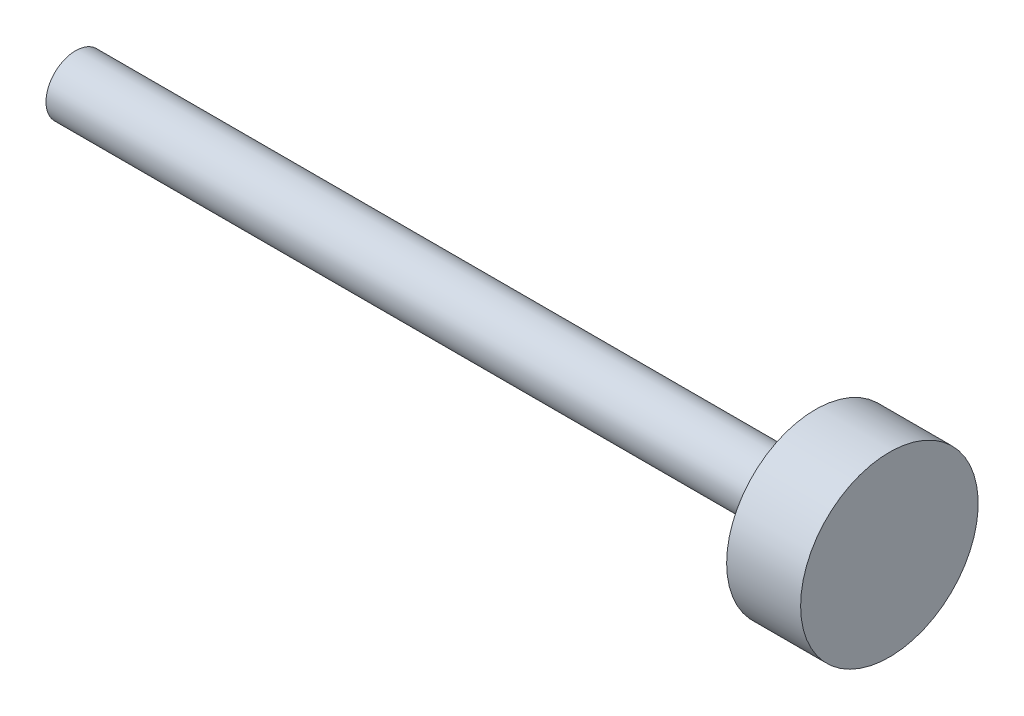
ISO-10303-21;
HEADER;
FILE_DESCRIPTION(('STEP AP214'),'2;1');
FILE_NAME('part.step','',(''),(''),'','','');
FILE_SCHEMA(('AUTOMOTIVE_DESIGN { 1 0 10303 214 1 1 1 1 }'));
ENDSEC;
DATA;
#1=APPLICATION_CONTEXT('core data for automotive mechanical design processes');
#2=APPLICATION_PROTOCOL_DEFINITION('international standard','automotive_design',2000,#1);
#3=PRODUCT_CONTEXT('',#1,'mechanical');
#4=PRODUCT('Part','Part','',(#3));
#5=PRODUCT_RELATED_PRODUCT_CATEGORY('part','',(#4));
#6=PRODUCT_DEFINITION_FORMATION('','',#4);
#7=PRODUCT_DEFINITION_CONTEXT('part definition',#1,'design');
#8=PRODUCT_DEFINITION('design','',#6,#7);
#9=PRODUCT_DEFINITION_SHAPE('','',#8);
#10=(LENGTH_UNIT() NAMED_UNIT(*) SI_UNIT(.MILLI.,.METRE.));
#11=(NAMED_UNIT(*) PLANE_ANGLE_UNIT() SI_UNIT($,.RADIAN.));
#12=(NAMED_UNIT(*) SI_UNIT($,.STERADIAN.) SOLID_ANGLE_UNIT());
#13=UNCERTAINTY_MEASURE_WITH_UNIT(LENGTH_MEASURE(1.E-05),#10,'distance_accuracy_value','');
#14=(GEOMETRIC_REPRESENTATION_CONTEXT(3) GLOBAL_UNCERTAINTY_ASSIGNED_CONTEXT((#13)) GLOBAL_UNIT_ASSIGNED_CONTEXT((#10,
#11,#12)) REPRESENTATION_CONTEXT('',''));
#15=CARTESIAN_POINT('',(0.,0.,0.));
#16=DIRECTION('',(0.,0.,1.));
#17=DIRECTION('',(1.,0.,0.));
#18=AXIS2_PLACEMENT_3D('',#15,#16,#17);
#19=CARTESIAN_POINT('',(58.1045877181206,0.,0.));
#20=DIRECTION('',(-1.,0.,0.));
#21=DIRECTION('',(0.,0.,1.));
#22=AXIS2_PLACEMENT_3D('',#19,#20,#21);
#23=PLANE('',#22);
#24=CARTESIAN_POINT('',(58.1045877181206,0.,0.));
#25=DIRECTION('',(-1.,0.,0.));
#26=DIRECTION('',(0.,0.,1.));
#27=AXIS2_PLACEMENT_3D('',#24,#25,#26);
#28=CIRCLE('',#27,12.);
#29=CARTESIAN_POINT('',(58.1045877181206,0.,12.));
#30=VERTEX_POINT('',#29);
#31=EDGE_CURVE('E10',#30,#30,#28,.T.);
#32=ORIENTED_EDGE('',*,*,#31,.F.);
#33=EDGE_LOOP('',(#32));
#34=FACE_BOUND('',#33,.T.);
#35=ADVANCED_FACE('F31',(#34),#23,.F.);
#36=CARTESIAN_POINT('',(-51.8954122818794,0.,0.));
#37=DIRECTION('',(-1.,0.,0.));
#38=DIRECTION('',(0.,0.,1.));
#39=AXIS2_PLACEMENT_3D('',#36,#37,#38);
#40=CYLINDRICAL_SURFACE('',#39,12.);
#41=CARTESIAN_POINT('',(48.1045877181206,0.,0.));
#42=DIRECTION('',(-1.,0.,0.));
#43=DIRECTION('',(0.,0.,1.));
#44=AXIS2_PLACEMENT_3D('',#41,#42,#43);
#45=CIRCLE('',#44,12.);
#46=CARTESIAN_POINT('',(48.1045877181206,0.,12.));
#47=VERTEX_POINT('',#46);
#48=EDGE_CURVE('E37',#47,#47,#45,.T.);
#49=ORIENTED_EDGE('',*,*,#48,.F.);
#50=EDGE_LOOP('',(#49));
#51=FACE_BOUND('',#50,.T.);
#52=ORIENTED_EDGE('',*,*,#31,.T.);
#53=EDGE_LOOP('',(#52));
#54=FACE_BOUND('',#53,.T.);
#55=ADVANCED_FACE('F61',(#51,#54),#40,.T.);
#56=CARTESIAN_POINT('',(48.1045877181206,12.,0.));
#57=DIRECTION('',(1.,0.,0.));
#58=DIRECTION('',(0.,0.,-1.));
#59=AXIS2_PLACEMENT_3D('',#56,#57,#58);
#60=PLANE('',#59);
#61=CARTESIAN_POINT('',(48.1045877181206,0.,0.));
#62=DIRECTION('',(-1.,0.,0.));
#63=DIRECTION('',(0.,0.,1.));
#64=AXIS2_PLACEMENT_3D('',#61,#62,#63);
#65=CIRCLE('',#64,4.00000000000001);
#66=CARTESIAN_POINT('',(48.1045877181206,0.,4.00000000000001));
#67=VERTEX_POINT('',#66);
#68=EDGE_CURVE('E41',#67,#67,#65,.T.);
#69=ORIENTED_EDGE('',*,*,#68,.F.);
#70=EDGE_LOOP('',(#69));
#71=FACE_BOUND('',#70,.T.);
#72=ORIENTED_EDGE('',*,*,#48,.T.);
#73=EDGE_LOOP('',(#72));
#74=FACE_BOUND('',#73,.T.);
#75=ADVANCED_FACE('F56',(#71,#74),#60,.F.);
#76=CARTESIAN_POINT('',(-51.8954122818794,0.,0.));
#77=DIRECTION('',(-1.,0.,0.));
#78=DIRECTION('',(0.,0.,1.));
#79=AXIS2_PLACEMENT_3D('',#76,#77,#78);
#80=CYLINDRICAL_SURFACE('',#79,4.00000000000001);
#81=CARTESIAN_POINT('',(-51.8954122818794,0.,0.));
#82=DIRECTION('',(-1.,0.,0.));
#83=DIRECTION('',(0.,0.,1.));
#84=AXIS2_PLACEMENT_3D('',#81,#82,#83);
#85=CIRCLE('',#84,4.);
#86=CARTESIAN_POINT('',(-51.8954122818794,0.,4.));
#87=VERTEX_POINT('',#86);
#88=EDGE_CURVE('E45',#87,#87,#85,.T.);
#89=ORIENTED_EDGE('',*,*,#88,.F.);
#90=EDGE_LOOP('',(#89));
#91=FACE_BOUND('',#90,.T.);
#92=ORIENTED_EDGE('',*,*,#68,.T.);
#93=EDGE_LOOP('',(#92));
#94=FACE_BOUND('',#93,.T.);
#95=ADVANCED_FACE('F53',(#91,#94),#80,.T.);
#96=CARTESIAN_POINT('',(-51.8954122818794,4.,0.));
#97=DIRECTION('',(1.,0.,0.));
#98=DIRECTION('',(0.,0.,-1.));
#99=AXIS2_PLACEMENT_3D('',#96,#97,#98);
#100=PLANE('',#99);
#101=ORIENTED_EDGE('',*,*,#88,.T.);
#102=EDGE_LOOP('',(#101));
#103=FACE_BOUND('',#102,.T.);
#104=ADVANCED_FACE('F51',(#103),#100,.F.);
#105=CLOSED_SHELL('',(#35,#55,#75,#95,#104));
#106=MANIFOLD_SOLID_BREP('B2',#105);
#107=ADVANCED_BREP_SHAPE_REPRESENTATION('',(#18,#106),#14);
#108=SHAPE_DEFINITION_REPRESENTATION(#9,#107);
ENDSEC;
END-ISO-10303-21;
